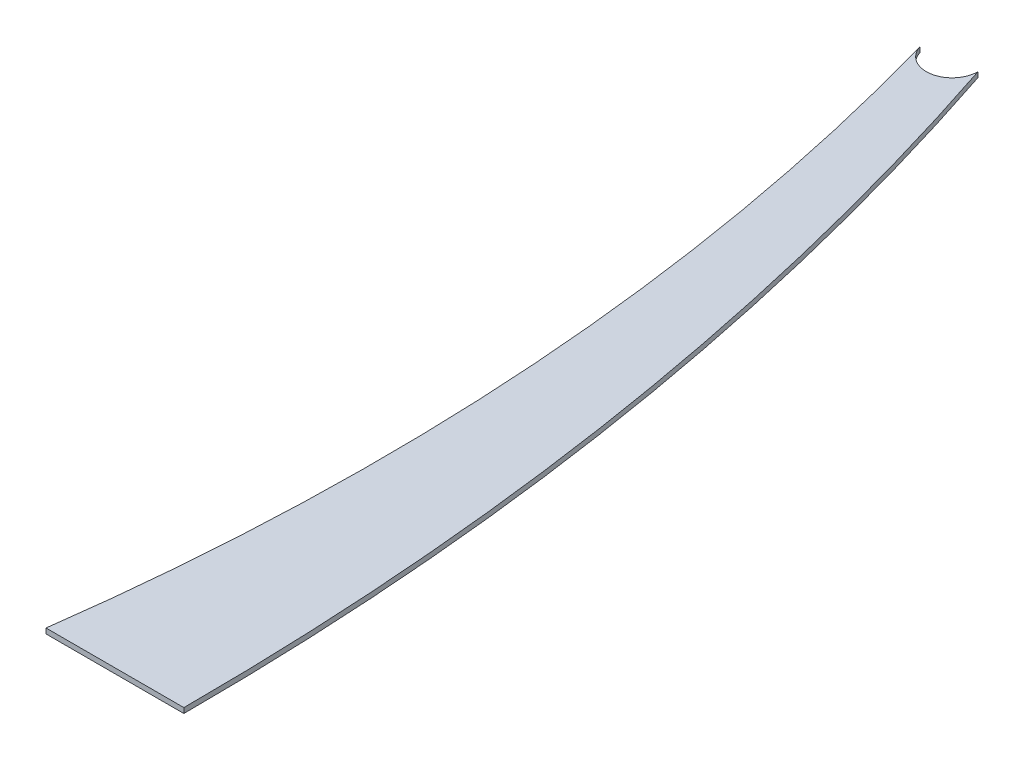
ISO-10303-21;
HEADER;
FILE_DESCRIPTION(('STEP AP214'),'2;1');
FILE_NAME('part.step','',(''),(''),'','','');
FILE_SCHEMA(('AUTOMOTIVE_DESIGN { 1 0 10303 214 1 1 1 1 }'));
ENDSEC;
DATA;
#1=APPLICATION_CONTEXT('core data for automotive mechanical design processes');
#2=APPLICATION_PROTOCOL_DEFINITION('international standard','automotive_design',2000,#1);
#3=PRODUCT_CONTEXT('',#1,'mechanical');
#4=PRODUCT('Part','Part','',(#3));
#5=PRODUCT_RELATED_PRODUCT_CATEGORY('part','',(#4));
#6=PRODUCT_DEFINITION_FORMATION('','',#4);
#7=PRODUCT_DEFINITION_CONTEXT('part definition',#1,'design');
#8=PRODUCT_DEFINITION('design','',#6,#7);
#9=PRODUCT_DEFINITION_SHAPE('','',#8);
#10=(LENGTH_UNIT() NAMED_UNIT(*) SI_UNIT(.MILLI.,.METRE.));
#11=(NAMED_UNIT(*) PLANE_ANGLE_UNIT() SI_UNIT($,.RADIAN.));
#12=(NAMED_UNIT(*) SI_UNIT($,.STERADIAN.) SOLID_ANGLE_UNIT());
#13=UNCERTAINTY_MEASURE_WITH_UNIT(LENGTH_MEASURE(1.E-05),#10,'distance_accuracy_value','');
#14=(GEOMETRIC_REPRESENTATION_CONTEXT(3) GLOBAL_UNCERTAINTY_ASSIGNED_CONTEXT((#13)) GLOBAL_UNIT_ASSIGNED_CONTEXT((#10,
#11,#12)) REPRESENTATION_CONTEXT('',''));
#15=CARTESIAN_POINT('',(0.,0.,0.));
#16=DIRECTION('',(0.,0.,1.));
#17=DIRECTION('',(1.,0.,0.));
#18=AXIS2_PLACEMENT_3D('',#15,#16,#17);
#19=CARTESIAN_POINT('',(-3322.,3.,0.));
#20=DIRECTION('',(0.,-1.,0.));
#21=DIRECTION('',(0.,0.,-1.));
#22=AXIS2_PLACEMENT_3D('',#19,#20,#21);
#23=CYLINDRICAL_SURFACE('',#22,3482.);
#24=CARTESIAN_POINT('',(-3322.,-3.,0.));
#25=DIRECTION('',(0.,1.,0.));
#26=DIRECTION('',(0.,0.,1.));
#27=AXIS2_PLACEMENT_3D('',#24,#25,#26);
#28=CIRCLE('',#27,3482.);
#29=CARTESIAN_POINT('',(160.,-3.,0.));
#30=VERTEX_POINT('',#29);
#31=CARTESIAN_POINT('',(-18.3166011253436,-3.,-1100.));
#32=VERTEX_POINT('',#31);
#33=EDGE_CURVE('E99',#30,#32,#28,.T.);
#34=ORIENTED_EDGE('',*,*,#33,.T.);
#35=DIRECTION('',(0.,-1.,0.));
#36=VECTOR('',#35,1.);
#37=CARTESIAN_POINT('',(-18.3166011253436,3.,-1100.));
#38=LINE('',#37,#36);
#39=CARTESIAN_POINT('',(-18.3166011253436,3.,-1100.));
#40=VERTEX_POINT('',#39);
#41=EDGE_CURVE('E11',#40,#32,#38,.T.);
#42=ORIENTED_EDGE('',*,*,#41,.F.);
#43=CARTESIAN_POINT('',(-3322.,3.,0.));
#44=DIRECTION('',(0.,1.,0.));
#45=DIRECTION('',(0.,0.,1.));
#46=AXIS2_PLACEMENT_3D('',#43,#44,#45);
#47=CIRCLE('',#46,3482.);
#48=CARTESIAN_POINT('',(160.,3.,0.));
#49=VERTEX_POINT('',#48);
#50=EDGE_CURVE('E87',#49,#40,#47,.T.);
#51=ORIENTED_EDGE('',*,*,#50,.F.);
#52=DIRECTION('',(0.,-1.,0.));
#53=VECTOR('',#52,1.);
#54=CARTESIAN_POINT('',(160.,3.,0.));
#55=LINE('',#54,#53);
#56=EDGE_CURVE('E95',#49,#30,#55,.T.);
#57=ORIENTED_EDGE('',*,*,#56,.T.);
#58=EDGE_LOOP('',(#34,#42,#51,#57));
#59=FACE_BOUND('',#58,.T.);
#60=ADVANCED_FACE('F36',(#59),#23,.T.);
#61=CARTESIAN_POINT('',(-48.3166011253436,3.,-1100.));
#62=DIRECTION('',(0.,-1.,0.));
#63=DIRECTION('',(0.,0.,-1.));
#64=AXIS2_PLACEMENT_3D('',#61,#62,#63);
#65=CYLINDRICAL_SURFACE('',#64,30.0000000000001);
#66=CARTESIAN_POINT('',(-48.3166011253436,-3.,-1100.));
#67=DIRECTION('',(0.,-1.,0.));
#68=DIRECTION('',(0.,0.,-1.));
#69=AXIS2_PLACEMENT_3D('',#66,#67,#68);
#70=CIRCLE('',#69,30.0000000000001);
#71=CARTESIAN_POINT('',(-77.179366486739,-3.,-1091.81826572828));
#72=VERTEX_POINT('',#71);
#73=EDGE_CURVE('E91',#32,#72,#70,.T.);
#74=ORIENTED_EDGE('',*,*,#73,.T.);
#75=DIRECTION('',(0.,-1.,0.));
#76=VECTOR('',#75,1.);
#77=CARTESIAN_POINT('',(-77.179366486739,3.,-1091.81826572828));
#78=LINE('',#77,#76);
#79=CARTESIAN_POINT('',(-77.179366486739,3.,-1091.81826572828));
#80=VERTEX_POINT('',#79);
#81=EDGE_CURVE('E44',#80,#72,#78,.T.);
#82=ORIENTED_EDGE('',*,*,#81,.F.);
#83=CARTESIAN_POINT('',(-48.3166011253436,3.,-1100.));
#84=DIRECTION('',(0.,-1.,0.));
#85=DIRECTION('',(0.,0.,-1.));
#86=AXIS2_PLACEMENT_3D('',#83,#84,#85);
#87=CIRCLE('',#86,30.0000000000001);
#88=EDGE_CURVE('E82',#40,#80,#87,.T.);
#89=ORIENTED_EDGE('',*,*,#88,.F.);
#90=ORIENTED_EDGE('',*,*,#41,.T.);
#91=EDGE_LOOP('',(#74,#82,#89,#90));
#92=FACE_BOUND('',#91,.T.);
#93=ADVANCED_FACE('F90',(#92),#65,.F.);
#94=CARTESIAN_POINT('',(-2655.58640543805,3.,-360.916670787925));
#95=DIRECTION('',(0.,-1.,0.));
#96=DIRECTION('',(0.,0.,-1.));
#97=AXIS2_PLACEMENT_3D('',#94,#95,#96);
#98=CYLINDRICAL_SURFACE('',#97,2680.);
#99=CARTESIAN_POINT('',(-2655.58640543805,-3.,-360.916670787925));
#100=DIRECTION('',(0.,-1.,0.));
#101=DIRECTION('',(0.,0.,-1.));
#102=AXIS2_PLACEMENT_3D('',#99,#100,#101);
#103=CIRCLE('',#102,2680.);
#104=CARTESIAN_POINT('',(0.,-3.,0.));
#105=VERTEX_POINT('',#104);
#106=EDGE_CURVE('E69',#72,#105,#103,.T.);
#107=ORIENTED_EDGE('',*,*,#106,.T.);
#108=DIRECTION('',(0.,-1.,0.));
#109=VECTOR('',#108,1.);
#110=CARTESIAN_POINT('',(0.,3.,0.));
#111=LINE('',#110,#109);
#112=CARTESIAN_POINT('',(0.,3.,0.));
#113=VERTEX_POINT('',#112);
#114=EDGE_CURVE('E92',#113,#105,#111,.T.);
#115=ORIENTED_EDGE('',*,*,#114,.F.);
#116=CARTESIAN_POINT('',(-2655.58640543805,3.,-360.916670787925));
#117=DIRECTION('',(0.,-1.,0.));
#118=DIRECTION('',(0.,0.,-1.));
#119=AXIS2_PLACEMENT_3D('',#116,#117,#118);
#120=CIRCLE('',#119,2680.);
#121=EDGE_CURVE('E85',#80,#113,#120,.T.);
#122=ORIENTED_EDGE('',*,*,#121,.F.);
#123=ORIENTED_EDGE('',*,*,#81,.T.);
#124=EDGE_LOOP('',(#107,#115,#122,#123));
#125=FACE_BOUND('',#124,.T.);
#126=ADVANCED_FACE('F93',(#125),#98,.F.);
#127=CARTESIAN_POINT('',(0.,3.,0.));
#128=DIRECTION('',(0.,0.,-1.));
#129=DIRECTION('',(-1.,0.,0.));
#130=AXIS2_PLACEMENT_3D('',#127,#128,#129);
#131=PLANE('',#130);
#132=DIRECTION('',(1.,0.,0.));
#133=VECTOR('',#132,1.);
#134=CARTESIAN_POINT('',(0.,-3.,0.));
#135=LINE('',#134,#133);
#136=EDGE_CURVE('E75',#105,#30,#135,.T.);
#137=ORIENTED_EDGE('',*,*,#136,.T.);
#138=ORIENTED_EDGE('',*,*,#56,.F.);
#139=DIRECTION('',(1.,0.,0.));
#140=VECTOR('',#139,1.);
#141=CARTESIAN_POINT('',(0.,3.,0.));
#142=LINE('',#141,#140);
#143=EDGE_CURVE('E52',#113,#49,#142,.T.);
#144=ORIENTED_EDGE('',*,*,#143,.F.);
#145=ORIENTED_EDGE('',*,*,#114,.T.);
#146=EDGE_LOOP('',(#137,#138,#144,#145));
#147=FACE_BOUND('',#146,.T.);
#148=ADVANCED_FACE('F106',(#147),#131,.F.);
#149=CARTESIAN_POINT('',(-3322.,3.,0.));
#150=DIRECTION('',(0.,1.,0.));
#151=DIRECTION('',(0.,0.,1.));
#152=AXIS2_PLACEMENT_3D('',#149,#150,#151);
#153=PLANE('',#152);
#154=ORIENTED_EDGE('',*,*,#50,.T.);
#155=ORIENTED_EDGE('',*,*,#88,.T.);
#156=ORIENTED_EDGE('',*,*,#121,.T.);
#157=ORIENTED_EDGE('',*,*,#143,.T.);
#158=EDGE_LOOP('',(#154,#155,#156,#157));
#159=FACE_BOUND('',#158,.T.);
#160=ADVANCED_FACE('F83',(#159),#153,.T.);
#161=CARTESIAN_POINT('',(-3322.,-3.,0.));
#162=DIRECTION('',(0.,1.,0.));
#163=DIRECTION('',(0.,0.,1.));
#164=AXIS2_PLACEMENT_3D('',#161,#162,#163);
#165=PLANE('',#164);
#166=ORIENTED_EDGE('',*,*,#33,.F.);
#167=ORIENTED_EDGE('',*,*,#136,.F.);
#168=ORIENTED_EDGE('',*,*,#106,.F.);
#169=ORIENTED_EDGE('',*,*,#73,.F.);
#170=EDGE_LOOP('',(#166,#167,#168,#169));
#171=FACE_BOUND('',#170,.T.);
#172=ADVANCED_FACE('F109',(#171),#165,.F.);
#173=CLOSED_SHELL('',(#60,#93,#126,#148,#160,#172));
#174=MANIFOLD_SOLID_BREP('B2',#173);
#175=ADVANCED_BREP_SHAPE_REPRESENTATION('',(#18,#174),#14);
#176=SHAPE_DEFINITION_REPRESENTATION(#9,#175);
ENDSEC;
END-ISO-10303-21;
